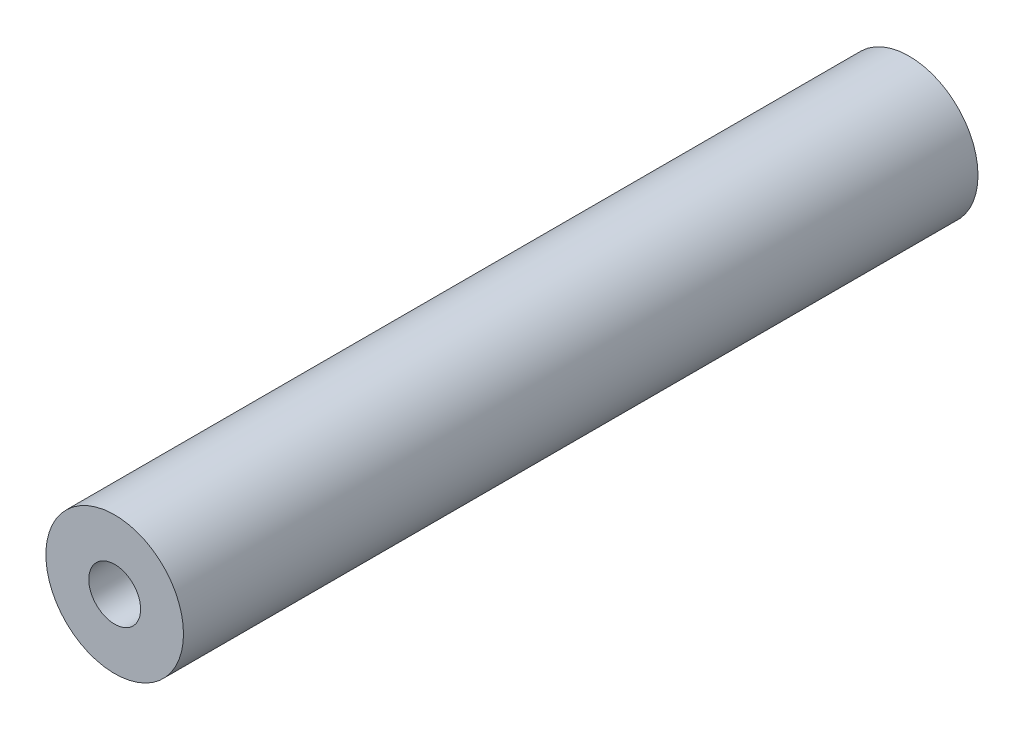
ISO-10303-21;
HEADER;
FILE_DESCRIPTION(('STEP AP214'),'2;1');
FILE_NAME('part.step','',(''),(''),'','','');
FILE_SCHEMA(('AUTOMOTIVE_DESIGN { 1 0 10303 214 1 1 1 1 }'));
ENDSEC;
DATA;
#1=APPLICATION_CONTEXT('core data for automotive mechanical design processes');
#2=APPLICATION_PROTOCOL_DEFINITION('international standard','automotive_design',2000,#1);
#3=PRODUCT_CONTEXT('',#1,'mechanical');
#4=PRODUCT('Part','Part','',(#3));
#5=PRODUCT_RELATED_PRODUCT_CATEGORY('part','',(#4));
#6=PRODUCT_DEFINITION_FORMATION('','',#4);
#7=PRODUCT_DEFINITION_CONTEXT('part definition',#1,'design');
#8=PRODUCT_DEFINITION('design','',#6,#7);
#9=PRODUCT_DEFINITION_SHAPE('','',#8);
#10=(LENGTH_UNIT() NAMED_UNIT(*) SI_UNIT(.MILLI.,.METRE.));
#11=(NAMED_UNIT(*) PLANE_ANGLE_UNIT() SI_UNIT($,.RADIAN.));
#12=(NAMED_UNIT(*) SI_UNIT($,.STERADIAN.) SOLID_ANGLE_UNIT());
#13=UNCERTAINTY_MEASURE_WITH_UNIT(LENGTH_MEASURE(1.E-05),#10,'distance_accuracy_value','');
#14=(GEOMETRIC_REPRESENTATION_CONTEXT(3) GLOBAL_UNCERTAINTY_ASSIGNED_CONTEXT((#13)) GLOBAL_UNIT_ASSIGNED_CONTEXT((#10,
#11,#12)) REPRESENTATION_CONTEXT('',''));
#15=CARTESIAN_POINT('',(0.,0.,0.));
#16=DIRECTION('',(0.,0.,1.));
#17=DIRECTION('',(1.,0.,0.));
#18=AXIS2_PLACEMENT_3D('',#15,#16,#17);
#19=CARTESIAN_POINT('',(0.,0.,34.64));
#20=DIRECTION('',(0.,0.,-1.));
#21=DIRECTION('',(-1.,0.,0.));
#22=AXIS2_PLACEMENT_3D('',#19,#20,#21);
#23=CYLINDRICAL_SURFACE('',#22,3.);
#24=CARTESIAN_POINT('',(0.,0.,34.64));
#25=DIRECTION('',(0.,0.,1.));
#26=DIRECTION('',(1.,0.,0.));
#27=AXIS2_PLACEMENT_3D('',#24,#25,#26);
#28=CIRCLE('',#27,3.);
#29=CARTESIAN_POINT('',(3.,0.,34.64));
#30=VERTEX_POINT('',#29);
#31=EDGE_CURVE('E10',#30,#30,#28,.T.);
#32=ORIENTED_EDGE('',*,*,#31,.F.);
#33=EDGE_LOOP('',(#32));
#34=FACE_BOUND('',#33,.T.);
#35=CARTESIAN_POINT('',(0.,0.,0.));
#36=DIRECTION('',(0.,0.,1.));
#37=DIRECTION('',(1.,0.,0.));
#38=AXIS2_PLACEMENT_3D('',#35,#36,#37);
#39=CIRCLE('',#38,3.);
#40=CARTESIAN_POINT('',(3.,0.,0.));
#41=VERTEX_POINT('',#40);
#42=EDGE_CURVE('E36',#41,#41,#39,.T.);
#43=ORIENTED_EDGE('',*,*,#42,.T.);
#44=EDGE_LOOP('',(#43));
#45=FACE_BOUND('',#44,.T.);
#46=ADVANCED_FACE('F33',(#34,#45),#23,.T.);
#47=CARTESIAN_POINT('',(0.,0.,34.64));
#48=DIRECTION('',(0.,0.,1.));
#49=DIRECTION('',(1.,0.,0.));
#50=AXIS2_PLACEMENT_3D('',#47,#48,#49);
#51=PLANE('',#50);
#52=CARTESIAN_POINT('',(0.,0.,34.64));
#53=DIRECTION('',(0.,0.,1.));
#54=DIRECTION('',(1.,0.,0.));
#55=AXIS2_PLACEMENT_3D('',#52,#53,#54);
#56=CIRCLE('',#55,1.1303);
#57=CARTESIAN_POINT('',(1.1303,0.,34.64));
#58=VERTEX_POINT('',#57);
#59=EDGE_CURVE('E47',#58,#58,#56,.T.);
#60=ORIENTED_EDGE('',*,*,#59,.F.);
#61=EDGE_LOOP('',(#60));
#62=FACE_BOUND('',#61,.T.);
#63=ORIENTED_EDGE('',*,*,#31,.T.);
#64=EDGE_LOOP('',(#63));
#65=FACE_BOUND('',#64,.T.);
#66=ADVANCED_FACE('F53',(#62,#65),#51,.T.);
#67=CARTESIAN_POINT('',(0.,0.,0.));
#68=DIRECTION('',(0.,0.,1.));
#69=DIRECTION('',(1.,0.,0.));
#70=AXIS2_PLACEMENT_3D('',#67,#68,#69);
#71=PLANE('',#70);
#72=CARTESIAN_POINT('',(0.,0.,0.));
#73=DIRECTION('',(0.,0.,1.));
#74=DIRECTION('',(1.,0.,0.));
#75=AXIS2_PLACEMENT_3D('',#72,#73,#74);
#76=CIRCLE('',#75,1.13029999999999);
#77=CARTESIAN_POINT('',(1.13029999999999,0.,0.));
#78=VERTEX_POINT('',#77);
#79=EDGE_CURVE('E43',#78,#78,#76,.T.);
#80=ORIENTED_EDGE('',*,*,#79,.T.);
#81=EDGE_LOOP('',(#80));
#82=FACE_BOUND('',#81,.T.);
#83=ORIENTED_EDGE('',*,*,#42,.F.);
#84=EDGE_LOOP('',(#83));
#85=FACE_BOUND('',#84,.T.);
#86=ADVANCED_FACE('F55',(#82,#85),#71,.F.);
#87=CARTESIAN_POINT('',(0.,0.,34.64));
#88=DIRECTION('',(0.,0.,1.));
#89=DIRECTION('',(1.,0.,0.));
#90=AXIS2_PLACEMENT_3D('',#87,#88,#89);
#91=CYLINDRICAL_SURFACE('',#90,1.1303);
#92=ORIENTED_EDGE('',*,*,#79,.F.);
#93=EDGE_LOOP('',(#92));
#94=FACE_BOUND('',#93,.T.);
#95=ORIENTED_EDGE('',*,*,#59,.T.);
#96=EDGE_LOOP('',(#95));
#97=FACE_BOUND('',#96,.T.);
#98=ADVANCED_FACE('F51',(#94,#97),#91,.F.);
#99=CLOSED_SHELL('',(#46,#66,#86,#98));
#100=MANIFOLD_SOLID_BREP('B2',#99);
#101=ADVANCED_BREP_SHAPE_REPRESENTATION('',(#18,#100),#14);
#102=SHAPE_DEFINITION_REPRESENTATION(#9,#101);
ENDSEC;
END-ISO-10303-21;
